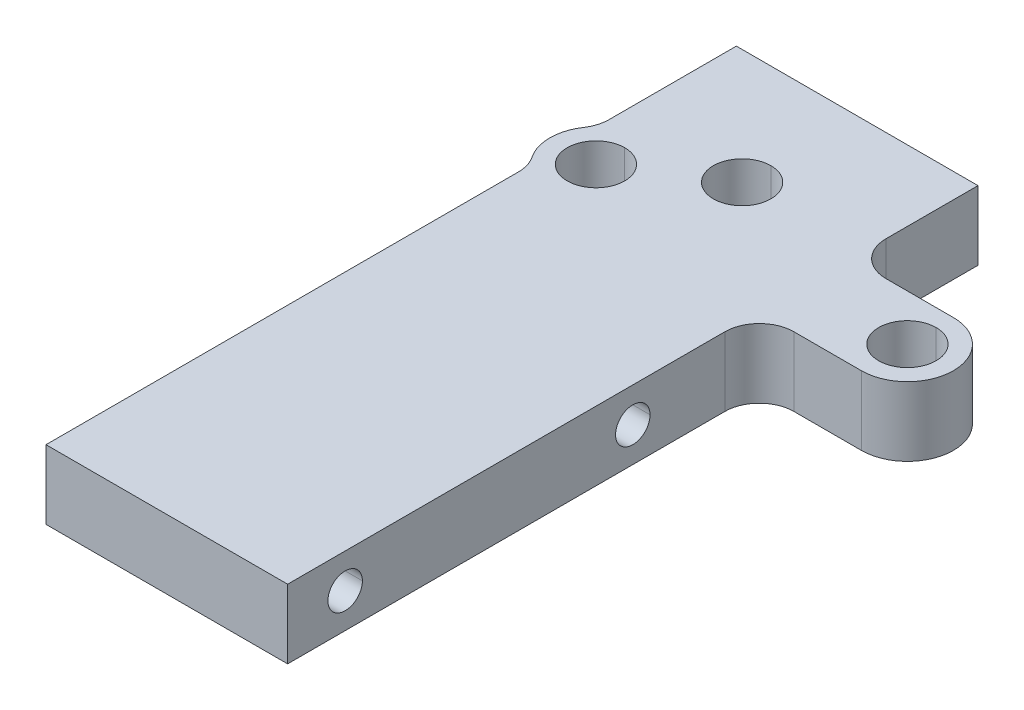
ISO-10303-21;
HEADER;
FILE_DESCRIPTION(('STEP AP214'),'2;1');
FILE_NAME('part.step','',(''),(''),'','','');
FILE_SCHEMA(('AUTOMOTIVE_DESIGN { 1 0 10303 214 1 1 1 1 }'));
ENDSEC;
DATA;
#1=APPLICATION_CONTEXT('core data for automotive mechanical design processes');
#2=APPLICATION_PROTOCOL_DEFINITION('international standard','automotive_design',2000,#1);
#3=PRODUCT_CONTEXT('',#1,'mechanical');
#4=PRODUCT('Part','Part','',(#3));
#5=PRODUCT_RELATED_PRODUCT_CATEGORY('part','',(#4));
#6=PRODUCT_DEFINITION_FORMATION('','',#4);
#7=PRODUCT_DEFINITION_CONTEXT('part definition',#1,'design');
#8=PRODUCT_DEFINITION('design','',#6,#7);
#9=PRODUCT_DEFINITION_SHAPE('','',#8);
#10=(LENGTH_UNIT() NAMED_UNIT(*) SI_UNIT(.MILLI.,.METRE.));
#11=(NAMED_UNIT(*) PLANE_ANGLE_UNIT() SI_UNIT($,.RADIAN.));
#12=(NAMED_UNIT(*) SI_UNIT($,.STERADIAN.) SOLID_ANGLE_UNIT());
#13=UNCERTAINTY_MEASURE_WITH_UNIT(LENGTH_MEASURE(1.E-05),#10,'distance_accuracy_value','');
#14=(GEOMETRIC_REPRESENTATION_CONTEXT(3) GLOBAL_UNCERTAINTY_ASSIGNED_CONTEXT((#13)) GLOBAL_UNIT_ASSIGNED_CONTEXT((#10,
#11,#12)) REPRESENTATION_CONTEXT('',''));
#15=CARTESIAN_POINT('',(0.,0.,0.));
#16=DIRECTION('',(0.,0.,1.));
#17=DIRECTION('',(1.,0.,0.));
#18=AXIS2_PLACEMENT_3D('',#15,#16,#17);
#19=CARTESIAN_POINT('',(29.8649167310371,1.,-45.));
#20=DIRECTION('',(0.,1.,0.));
#21=DIRECTION('',(0.,0.,1.));
#22=AXIS2_PLACEMENT_3D('',#19,#20,#21);
#23=CYLINDRICAL_SURFACE('',#22,2.5);
#24=DIRECTION('',(0.,1.,0.));
#25=VECTOR('',#24,1.);
#26=CARTESIAN_POINT('',(29.8649167310371,1.,-47.5));
#27=LINE('',#26,#25);
#28=CARTESIAN_POINT('',(29.8649167310371,1.,-47.5));
#29=VERTEX_POINT('',#28);
#30=CARTESIAN_POINT('',(29.8649167310371,6.,-47.5));
#31=VERTEX_POINT('',#30);
#32=EDGE_CURVE('E532',#29,#31,#27,.T.);
#33=ORIENTED_EDGE('',*,*,#32,.F.);
#34=CARTESIAN_POINT('',(29.8649167310371,1.,-45.));
#35=DIRECTION('',(0.,1.,0.));
#36=DIRECTION('',(0.,0.,1.));
#37=AXIS2_PLACEMENT_3D('',#34,#35,#36);
#38=CIRCLE('',#37,2.5);
#39=CARTESIAN_POINT('',(29.8649167310371,1.,-42.5));
#40=VERTEX_POINT('',#39);
#41=EDGE_CURVE('E11',#40,#29,#38,.T.);
#42=ORIENTED_EDGE('',*,*,#41,.F.);
#43=DIRECTION('',(0.,1.,0.));
#44=VECTOR('',#43,1.);
#45=CARTESIAN_POINT('',(29.8649167310371,1.,-42.5));
#46=LINE('',#45,#44);
#47=CARTESIAN_POINT('',(29.8649167310371,6.,-42.5));
#48=VERTEX_POINT('',#47);
#49=EDGE_CURVE('E256',#40,#48,#46,.T.);
#50=ORIENTED_EDGE('',*,*,#49,.T.);
#51=CARTESIAN_POINT('',(29.8649167310371,6.,-45.));
#52=DIRECTION('',(0.,1.,0.));
#53=DIRECTION('',(0.,0.,1.));
#54=AXIS2_PLACEMENT_3D('',#51,#52,#53);
#55=CIRCLE('',#54,2.5);
#56=EDGE_CURVE('E286',#48,#31,#55,.T.);
#57=ORIENTED_EDGE('',*,*,#56,.T.);
#58=EDGE_LOOP('',(#33,#42,#50,#57));
#59=FACE_BOUND('',#58,.T.);
#60=ADVANCED_FACE('F17',(#59),#23,.F.);
#61=CARTESIAN_POINT('',(29.8649167310371,1.,-45.));
#62=DIRECTION('',(0.,1.,0.));
#63=DIRECTION('',(1.,0.,0.));
#64=AXIS2_PLACEMENT_3D('',#61,#62,#63);
#65=PLANE('',#64);
#66=CARTESIAN_POINT('',(29.8649167310371,1.,-45.));
#67=DIRECTION('',(0.,-1.,0.));
#68=DIRECTION('',(0.,0.,1.));
#69=AXIS2_PLACEMENT_3D('',#66,#67,#68);
#70=CIRCLE('',#69,1.25);
#71=CARTESIAN_POINT('',(29.8649167310371,1.,-43.75));
#72=VERTEX_POINT('',#71);
#73=CARTESIAN_POINT('',(29.8649167310371,1.,-46.25));
#74=VERTEX_POINT('',#73);
#75=EDGE_CURVE('E263',#72,#74,#70,.T.);
#76=ORIENTED_EDGE('',*,*,#75,.T.);
#77=CARTESIAN_POINT('',(29.8649167310371,1.,-45.));
#78=DIRECTION('',(0.,-1.,0.));
#79=DIRECTION('',(0.,0.,1.));
#80=AXIS2_PLACEMENT_3D('',#77,#78,#79);
#81=CIRCLE('',#80,1.25);
#82=EDGE_CURVE('E381',#74,#72,#81,.T.);
#83=ORIENTED_EDGE('',*,*,#82,.T.);
#84=EDGE_LOOP('',(#76,#83));
#85=FACE_BOUND('',#84,.T.);
#86=ORIENTED_EDGE('',*,*,#41,.T.);
#87=CARTESIAN_POINT('',(29.8649167310371,1.,-45.));
#88=DIRECTION('',(0.,1.,0.));
#89=DIRECTION('',(0.,0.,1.));
#90=AXIS2_PLACEMENT_3D('',#87,#88,#89);
#91=CIRCLE('',#90,2.5);
#92=EDGE_CURVE('E540',#29,#40,#91,.T.);
#93=ORIENTED_EDGE('',*,*,#92,.T.);
#94=EDGE_LOOP('',(#86,#93));
#95=FACE_BOUND('',#94,.T.);
#96=ADVANCED_FACE('F662',(#85,#95),#65,.T.);
#97=CARTESIAN_POINT('',(2.79637384084611,1.,-45.));
#98=DIRECTION('',(0.,1.,0.));
#99=DIRECTION('',(0.,0.,1.));
#100=AXIS2_PLACEMENT_3D('',#97,#98,#99);
#101=CYLINDRICAL_SURFACE('',#100,2.5);
#102=DIRECTION('',(0.,1.,0.));
#103=VECTOR('',#102,1.);
#104=CARTESIAN_POINT('',(2.79637384084612,1.,-47.5));
#105=LINE('',#104,#103);
#106=CARTESIAN_POINT('',(2.79637384084612,1.,-47.5));
#107=VERTEX_POINT('',#106);
#108=CARTESIAN_POINT('',(2.79637384084612,6.,-47.5));
#109=VERTEX_POINT('',#108);
#110=EDGE_CURVE('E276',#107,#109,#105,.T.);
#111=ORIENTED_EDGE('',*,*,#110,.F.);
#112=CARTESIAN_POINT('',(2.79637384084611,1.,-45.));
#113=DIRECTION('',(0.,1.,0.));
#114=DIRECTION('',(0.,0.,1.));
#115=AXIS2_PLACEMENT_3D('',#112,#113,#114);
#116=CIRCLE('',#115,2.5);
#117=CARTESIAN_POINT('',(2.79637384084611,1.,-42.5));
#118=VERTEX_POINT('',#117);
#119=EDGE_CURVE('E25',#118,#107,#116,.T.);
#120=ORIENTED_EDGE('',*,*,#119,.F.);
#121=DIRECTION('',(0.,1.,0.));
#122=VECTOR('',#121,1.);
#123=CARTESIAN_POINT('',(2.79637384084611,1.,-42.5));
#124=LINE('',#123,#122);
#125=CARTESIAN_POINT('',(2.79637384084611,6.,-42.5));
#126=VERTEX_POINT('',#125);
#127=EDGE_CURVE('E285',#118,#126,#124,.T.);
#128=ORIENTED_EDGE('',*,*,#127,.T.);
#129=CARTESIAN_POINT('',(2.79637384084611,6.,-45.));
#130=DIRECTION('',(0.,1.,0.));
#131=DIRECTION('',(0.,0.,1.));
#132=AXIS2_PLACEMENT_3D('',#129,#130,#131);
#133=CIRCLE('',#132,2.5);
#134=EDGE_CURVE('E291',#126,#109,#133,.T.);
#135=ORIENTED_EDGE('',*,*,#134,.T.);
#136=EDGE_LOOP('',(#111,#120,#128,#135));
#137=FACE_BOUND('',#136,.T.);
#138=ADVANCED_FACE('F509',(#137),#101,.F.);
#139=CARTESIAN_POINT('',(2.79637384084611,1.,-45.));
#140=DIRECTION('',(0.,1.,0.));
#141=DIRECTION('',(1.,0.,0.));
#142=AXIS2_PLACEMENT_3D('',#139,#140,#141);
#143=PLANE('',#142);
#144=CARTESIAN_POINT('',(2.79637384084611,1.,-45.));
#145=DIRECTION('',(0.,-1.,0.));
#146=DIRECTION('',(0.,0.,1.));
#147=AXIS2_PLACEMENT_3D('',#144,#145,#146);
#148=CIRCLE('',#147,1.25);
#149=CARTESIAN_POINT('',(2.79637384084611,1.,-43.75));
#150=VERTEX_POINT('',#149);
#151=CARTESIAN_POINT('',(2.79637384084611,1.,-46.25));
#152=VERTEX_POINT('',#151);
#153=EDGE_CURVE('E354',#150,#152,#148,.T.);
#154=ORIENTED_EDGE('',*,*,#153,.T.);
#155=CARTESIAN_POINT('',(2.79637384084611,1.,-45.));
#156=DIRECTION('',(0.,-1.,0.));
#157=DIRECTION('',(0.,0.,1.));
#158=AXIS2_PLACEMENT_3D('',#155,#156,#157);
#159=CIRCLE('',#158,1.25);
#160=EDGE_CURVE('E338',#152,#150,#159,.T.);
#161=ORIENTED_EDGE('',*,*,#160,.T.);
#162=EDGE_LOOP('',(#154,#161));
#163=FACE_BOUND('',#162,.T.);
#164=ORIENTED_EDGE('',*,*,#119,.T.);
#165=CARTESIAN_POINT('',(2.79637384084611,1.,-45.));
#166=DIRECTION('',(0.,1.,0.));
#167=DIRECTION('',(0.,0.,1.));
#168=AXIS2_PLACEMENT_3D('',#165,#166,#167);
#169=CIRCLE('',#168,2.5);
#170=EDGE_CURVE('E281',#107,#118,#169,.T.);
#171=ORIENTED_EDGE('',*,*,#170,.T.);
#172=EDGE_LOOP('',(#164,#171));
#173=FACE_BOUND('',#172,.T.);
#174=ADVANCED_FACE('F501',(#163,#173),#143,.T.);
#175=CARTESIAN_POINT('',(24.,6.,-52.));
#176=DIRECTION('',(0.,-1.,0.));
#177=DIRECTION('',(0.,0.,-1.));
#178=AXIS2_PLACEMENT_3D('',#175,#176,#177);
#179=CYLINDRICAL_SURFACE('',#178,3.);
#180=CARTESIAN_POINT('',(24.,6.,-52.));
#181=DIRECTION('',(0.,-1.,0.));
#182=DIRECTION('',(0.,0.,-1.));
#183=AXIS2_PLACEMENT_3D('',#180,#181,#182);
#184=CIRCLE('',#183,3.);
#185=CARTESIAN_POINT('',(24.,6.,-49.));
#186=VERTEX_POINT('',#185);
#187=CARTESIAN_POINT('',(21.,6.,-52.));
#188=VERTEX_POINT('',#187);
#189=EDGE_CURVE('E429',#186,#188,#184,.T.);
#190=ORIENTED_EDGE('',*,*,#189,.F.);
#191=DIRECTION('',(0.,1.,0.));
#192=VECTOR('',#191,1.);
#193=CARTESIAN_POINT('',(24.,-35.9694690041591,-49.));
#194=LINE('',#193,#192);
#195=CARTESIAN_POINT('',(24.,0.,-49.));
#196=VERTEX_POINT('',#195);
#197=EDGE_CURVE('E471',#196,#186,#194,.T.);
#198=ORIENTED_EDGE('',*,*,#197,.F.);
#199=CARTESIAN_POINT('',(24.,0.,-52.));
#200=DIRECTION('',(0.,1.,0.));
#201=DIRECTION('',(0.,0.,-1.));
#202=AXIS2_PLACEMENT_3D('',#199,#200,#201);
#203=CIRCLE('',#202,3.);
#204=CARTESIAN_POINT('',(21.,0.,-52.));
#205=VERTEX_POINT('',#204);
#206=EDGE_CURVE('E252',#205,#196,#203,.T.);
#207=ORIENTED_EDGE('',*,*,#206,.F.);
#208=DIRECTION('',(0.,-1.,0.));
#209=VECTOR('',#208,1.);
#210=CARTESIAN_POINT('',(21.,6.,-52.));
#211=LINE('',#210,#209);
#212=EDGE_CURVE('E270',#188,#205,#211,.T.);
#213=ORIENTED_EDGE('',*,*,#212,.F.);
#214=EDGE_LOOP('',(#190,#198,#207,#213));
#215=FACE_BOUND('',#214,.T.);
#216=ADVANCED_FACE('F579',(#215),#179,.F.);
#217=CARTESIAN_POINT('',(24.,6.,-38.));
#218=DIRECTION('',(0.,1.,0.));
#219=DIRECTION('',(0.,0.,1.));
#220=AXIS2_PLACEMENT_3D('',#217,#218,#219);
#221=CYLINDRICAL_SURFACE('',#220,3.);
#222=CARTESIAN_POINT('',(24.,0.,-38.));
#223=DIRECTION('',(0.,1.,0.));
#224=DIRECTION('',(0.,0.,-1.));
#225=AXIS2_PLACEMENT_3D('',#222,#223,#224);
#226=CIRCLE('',#225,3.);
#227=CARTESIAN_POINT('',(24.,0.,-41.));
#228=VERTEX_POINT('',#227);
#229=CARTESIAN_POINT('',(21.,0.,-38.));
#230=VERTEX_POINT('',#229);
#231=EDGE_CURVE('E239',#228,#230,#226,.T.);
#232=ORIENTED_EDGE('',*,*,#231,.F.);
#233=DIRECTION('',(0.,-1.,0.));
#234=VECTOR('',#233,1.);
#235=CARTESIAN_POINT('',(24.,-35.9694690041591,-41.));
#236=LINE('',#235,#234);
#237=CARTESIAN_POINT('',(24.,6.,-41.));
#238=VERTEX_POINT('',#237);
#239=EDGE_CURVE('E235',#238,#228,#236,.T.);
#240=ORIENTED_EDGE('',*,*,#239,.F.);
#241=CARTESIAN_POINT('',(24.,6.,-38.));
#242=DIRECTION('',(0.,-1.,0.));
#243=DIRECTION('',(0.,0.,-1.));
#244=AXIS2_PLACEMENT_3D('',#241,#242,#243);
#245=CIRCLE('',#244,3.);
#246=CARTESIAN_POINT('',(21.,6.,-38.));
#247=VERTEX_POINT('',#246);
#248=EDGE_CURVE('E314',#247,#238,#245,.T.);
#249=ORIENTED_EDGE('',*,*,#248,.F.);
#250=DIRECTION('',(0.,1.,0.));
#251=VECTOR('',#250,1.);
#252=CARTESIAN_POINT('',(21.,6.,-38.));
#253=LINE('',#252,#251);
#254=EDGE_CURVE('E52',#230,#247,#253,.T.);
#255=ORIENTED_EDGE('',*,*,#254,.F.);
#256=EDGE_LOOP('',(#232,#240,#249,#255));
#257=FACE_BOUND('',#256,.T.);
#258=ADVANCED_FACE('F583',(#257),#221,.F.);
#259=CARTESIAN_POINT('',(-3.,-35.9694690041591,-41.075455402578));
#260=DIRECTION('',(0.,1.,0.));
#261=DIRECTION('',(0.,0.,1.));
#262=AXIS2_PLACEMENT_3D('',#259,#260,#261);
#263=CYLINDRICAL_SURFACE('',#262,3.);
#264=CARTESIAN_POINT('',(-3.,6.,-41.075455402578));
#265=DIRECTION('',(0.,-1.,0.));
#266=DIRECTION('',(0.,0.,-1.));
#267=AXIS2_PLACEMENT_3D('',#264,#265,#266);
#268=CIRCLE('',#267,3.);
#269=CARTESIAN_POINT('',(-0.515839782494522,6.,-42.7574030871874));
#270=VERTEX_POINT('',#269);
#271=CARTESIAN_POINT('',(0.,6.,-41.075455402578));
#272=VERTEX_POINT('',#271);
#273=EDGE_CURVE('E409',#270,#272,#268,.T.);
#274=ORIENTED_EDGE('',*,*,#273,.F.);
#275=DIRECTION('',(0.,1.,0.));
#276=VECTOR('',#275,1.);
#277=CARTESIAN_POINT('',(-0.515839782494522,-35.9694690041591,-42.7574030871874));
#278=LINE('',#277,#276);
#279=CARTESIAN_POINT('',(-0.515839782494522,0.,-42.7574030871874));
#280=VERTEX_POINT('',#279);
#281=EDGE_CURVE('E490',#280,#270,#278,.T.);
#282=ORIENTED_EDGE('',*,*,#281,.F.);
#283=CARTESIAN_POINT('',(-3.,0.,-41.075455402578));
#284=DIRECTION('',(0.,1.,0.));
#285=DIRECTION('',(0.,0.,-1.));
#286=AXIS2_PLACEMENT_3D('',#283,#284,#285);
#287=CIRCLE('',#286,3.);
#288=CARTESIAN_POINT('',(0.,0.,-41.075455402578));
#289=VERTEX_POINT('',#288);
#290=EDGE_CURVE('E447',#289,#280,#287,.T.);
#291=ORIENTED_EDGE('',*,*,#290,.F.);
#292=DIRECTION('',(0.,-1.,0.));
#293=VECTOR('',#292,1.);
#294=CARTESIAN_POINT('',(0.,6.,-41.075455402578));
#295=LINE('',#294,#293);
#296=EDGE_CURVE('E461',#272,#289,#295,.T.);
#297=ORIENTED_EDGE('',*,*,#296,.F.);
#298=EDGE_LOOP('',(#274,#282,#291,#297));
#299=FACE_BOUND('',#298,.T.);
#300=ADVANCED_FACE('F726',(#299),#263,.F.);
#301=CARTESIAN_POINT('',(-3.,-35.9694690041591,-48.9245445974221));
#302=DIRECTION('',(0.,1.,0.));
#303=DIRECTION('',(0.,0.,1.));
#304=AXIS2_PLACEMENT_3D('',#301,#302,#303);
#305=CYLINDRICAL_SURFACE('',#304,3.);
#306=CARTESIAN_POINT('',(-3.,0.,-48.9245445974221));
#307=DIRECTION('',(0.,1.,0.));
#308=DIRECTION('',(0.,0.,-1.));
#309=AXIS2_PLACEMENT_3D('',#306,#307,#308);
#310=CIRCLE('',#309,3.);
#311=CARTESIAN_POINT('',(-0.515839782494522,0.,-47.2425969128126));
#312=VERTEX_POINT('',#311);
#313=CARTESIAN_POINT('',(0.,0.,-48.9245445974221));
#314=VERTEX_POINT('',#313);
#315=EDGE_CURVE('E350',#312,#314,#310,.T.);
#316=ORIENTED_EDGE('',*,*,#315,.F.);
#317=DIRECTION('',(0.,-1.,0.));
#318=VECTOR('',#317,1.);
#319=CARTESIAN_POINT('',(-0.515839782494522,-35.9694690041591,-47.2425969128126));
#320=LINE('',#319,#318);
#321=CARTESIAN_POINT('',(-0.515839782494522,6.,-47.2425969128126));
#322=VERTEX_POINT('',#321);
#323=EDGE_CURVE('E470',#322,#312,#320,.T.);
#324=ORIENTED_EDGE('',*,*,#323,.F.);
#325=CARTESIAN_POINT('',(-3.,6.,-48.9245445974221));
#326=DIRECTION('',(0.,-1.,0.));
#327=DIRECTION('',(0.,0.,-1.));
#328=AXIS2_PLACEMENT_3D('',#325,#326,#327);
#329=CIRCLE('',#328,3.);
#330=CARTESIAN_POINT('',(0.,6.,-48.9245445974221));
#331=VERTEX_POINT('',#330);
#332=EDGE_CURVE('E408',#331,#322,#329,.T.);
#333=ORIENTED_EDGE('',*,*,#332,.F.);
#334=DIRECTION('',(0.,1.,0.));
#335=VECTOR('',#334,1.);
#336=CARTESIAN_POINT('',(0.,6.,-48.9245445974221));
#337=LINE('',#336,#335);
#338=EDGE_CURVE('E297',#314,#331,#337,.T.);
#339=ORIENTED_EDGE('',*,*,#338,.F.);
#340=EDGE_LOOP('',(#316,#324,#333,#339));
#341=FACE_BOUND('',#340,.T.);
#342=ADVANCED_FACE('F567',(#341),#305,.F.);
#343=CARTESIAN_POINT('',(2.79637384084611,-35.9694690041591,-45.));
#344=DIRECTION('',(0.,1.,0.));
#345=DIRECTION('',(0.,0.,1.));
#346=AXIS2_PLACEMENT_3D('',#343,#344,#345);
#347=CYLINDRICAL_SURFACE('',#346,4.);
#348=CARTESIAN_POINT('',(2.79637384084611,6.,-45.));
#349=DIRECTION('',(0.,1.,0.));
#350=DIRECTION('',(0.,0.,1.));
#351=AXIS2_PLACEMENT_3D('',#348,#349,#350);
#352=CIRCLE('',#351,4.);
#353=EDGE_CURVE('E413',#322,#270,#352,.T.);
#354=ORIENTED_EDGE('',*,*,#353,.F.);
#355=ORIENTED_EDGE('',*,*,#323,.T.);
#356=CARTESIAN_POINT('',(2.79637384084611,0.,-45.));
#357=DIRECTION('',(0.,1.,0.));
#358=DIRECTION('',(0.,0.,-1.));
#359=AXIS2_PLACEMENT_3D('',#356,#357,#358);
#360=CIRCLE('',#359,4.);
#361=EDGE_CURVE('E448',#312,#280,#360,.T.);
#362=ORIENTED_EDGE('',*,*,#361,.T.);
#363=ORIENTED_EDGE('',*,*,#281,.T.);
#364=EDGE_LOOP('',(#354,#355,#362,#363));
#365=FACE_BOUND('',#364,.T.);
#366=ADVANCED_FACE('F748',(#365),#347,.T.);
#367=CARTESIAN_POINT('',(2.79637384084611,-35.9694690041591,-41.));
#368=DIRECTION('',(0.,0.,1.));
#369=DIRECTION('',(1.,0.,0.));
#370=AXIS2_PLACEMENT_3D('',#367,#368,#369);
#371=PLANE('',#370);
#372=DIRECTION('',(1.,0.,0.));
#373=VECTOR('',#372,1.);
#374=CARTESIAN_POINT('',(2.79637384084611,6.,-41.));
#375=LINE('',#374,#373);
#376=CARTESIAN_POINT('',(29.8649167310371,6.,-41.));
#377=VERTEX_POINT('',#376);
#378=EDGE_CURVE('E387',#238,#377,#375,.T.);
#379=ORIENTED_EDGE('',*,*,#378,.F.);
#380=ORIENTED_EDGE('',*,*,#239,.T.);
#381=DIRECTION('',(1.,0.,0.));
#382=VECTOR('',#381,1.);
#383=CARTESIAN_POINT('',(2.79637384084611,0.,-41.));
#384=LINE('',#383,#382);
#385=CARTESIAN_POINT('',(29.8649167310371,0.,-41.));
#386=VERTEX_POINT('',#385);
#387=EDGE_CURVE('E233',#228,#386,#384,.T.);
#388=ORIENTED_EDGE('',*,*,#387,.T.);
#389=DIRECTION('',(0.,1.,0.));
#390=VECTOR('',#389,1.);
#391=CARTESIAN_POINT('',(29.8649167310371,-35.9694690041591,-41.));
#392=LINE('',#391,#390);
#393=EDGE_CURVE('E217',#386,#377,#392,.T.);
#394=ORIENTED_EDGE('',*,*,#393,.T.);
#395=EDGE_LOOP('',(#379,#380,#388,#394));
#396=FACE_BOUND('',#395,.T.);
#397=ADVANCED_FACE('F234',(#396),#371,.T.);
#398=CARTESIAN_POINT('',(2.79637384084611,-35.9694690041591,-49.));
#399=DIRECTION('',(0.,0.,-1.));
#400=DIRECTION('',(0.,-1.,0.));
#401=AXIS2_PLACEMENT_3D('',#398,#399,#400);
#402=PLANE('',#401);
#403=DIRECTION('',(-1.,0.,0.));
#404=VECTOR('',#403,1.);
#405=CARTESIAN_POINT('',(2.79637384084611,0.,-49.));
#406=LINE('',#405,#404);
#407=CARTESIAN_POINT('',(29.8649167310371,0.,-49.));
#408=VERTEX_POINT('',#407);
#409=EDGE_CURVE('E245',#408,#196,#406,.T.);
#410=ORIENTED_EDGE('',*,*,#409,.T.);
#411=ORIENTED_EDGE('',*,*,#197,.T.);
#412=DIRECTION('',(-1.,0.,0.));
#413=VECTOR('',#412,1.);
#414=CARTESIAN_POINT('',(2.79637384084611,6.,-49.));
#415=LINE('',#414,#413);
#416=CARTESIAN_POINT('',(29.8649167310371,6.,-49.));
#417=VERTEX_POINT('',#416);
#418=EDGE_CURVE('E432',#417,#186,#415,.T.);
#419=ORIENTED_EDGE('',*,*,#418,.F.);
#420=DIRECTION('',(0.,1.,0.));
#421=VECTOR('',#420,1.);
#422=CARTESIAN_POINT('',(29.8649167310371,-35.9694690041591,-49.));
#423=LINE('',#422,#421);
#424=EDGE_CURVE('E229',#408,#417,#423,.T.);
#425=ORIENTED_EDGE('',*,*,#424,.F.);
#426=EDGE_LOOP('',(#410,#411,#419,#425));
#427=FACE_BOUND('',#426,.T.);
#428=ADVANCED_FACE('F582',(#427),#402,.T.);
#429=CARTESIAN_POINT('',(29.8649167310371,-35.9694690041591,-45.));
#430=DIRECTION('',(0.,1.,0.));
#431=DIRECTION('',(0.,0.,1.));
#432=AXIS2_PLACEMENT_3D('',#429,#430,#431);
#433=CYLINDRICAL_SURFACE('',#432,4.);
#434=ORIENTED_EDGE('',*,*,#393,.F.);
#435=CARTESIAN_POINT('',(29.8649167310371,0.,-45.));
#436=DIRECTION('',(0.,1.,0.));
#437=DIRECTION('',(0.,0.,-1.));
#438=AXIS2_PLACEMENT_3D('',#435,#436,#437);
#439=CIRCLE('',#438,4.);
#440=EDGE_CURVE('E221',#386,#408,#439,.T.);
#441=ORIENTED_EDGE('',*,*,#440,.T.);
#442=ORIENTED_EDGE('',*,*,#424,.T.);
#443=CARTESIAN_POINT('',(29.8649167310371,6.,-45.));
#444=DIRECTION('',(0.,1.,0.));
#445=DIRECTION('',(0.,0.,1.));
#446=AXIS2_PLACEMENT_3D('',#443,#444,#445);
#447=CIRCLE('',#446,4.);
#448=EDGE_CURVE('E224',#377,#417,#447,.T.);
#449=ORIENTED_EDGE('',*,*,#448,.F.);
#450=EDGE_LOOP('',(#434,#441,#442,#449));
#451=FACE_BOUND('',#450,.T.);
#452=ADVANCED_FACE('F219',(#451),#433,.T.);
#453=CARTESIAN_POINT('',(-0.001000000000001,3.,-30.));
#454=DIRECTION('',(1.,0.,0.));
#455=DIRECTION('',(0.,0.,-1.));
#456=AXIS2_PLACEMENT_3D('',#453,#454,#455);
#457=CYLINDRICAL_SURFACE('',#456,1.5);
#458=DIRECTION('',(1.,0.,0.));
#459=VECTOR('',#458,1.);
#460=CARTESIAN_POINT('',(-0.001000000000001,3.,-28.5));
#461=LINE('',#460,#459);
#462=CARTESIAN_POINT('',(0.,3.,-28.5));
#463=VERTEX_POINT('',#462);
#464=CARTESIAN_POINT('',(21.,3.,-28.5));
#465=VERTEX_POINT('',#464);
#466=EDGE_CURVE('E319',#463,#465,#461,.T.);
#467=ORIENTED_EDGE('',*,*,#466,.F.);
#468=CARTESIAN_POINT('',(0.,3.,-30.));
#469=DIRECTION('',(-1.,0.,0.));
#470=DIRECTION('',(0.,0.,-1.));
#471=AXIS2_PLACEMENT_3D('',#468,#469,#470);
#472=CIRCLE('',#471,1.5);
#473=CARTESIAN_POINT('',(0.,3.,-31.5));
#474=VERTEX_POINT('',#473);
#475=EDGE_CURVE('E467',#463,#474,#472,.T.);
#476=ORIENTED_EDGE('',*,*,#475,.T.);
#477=DIRECTION('',(1.,0.,0.));
#478=VECTOR('',#477,1.);
#479=CARTESIAN_POINT('',(-0.001000000000001,3.,-31.5));
#480=LINE('',#479,#478);
#481=CARTESIAN_POINT('',(21.,3.,-31.5));
#482=VERTEX_POINT('',#481);
#483=EDGE_CURVE('E305',#474,#482,#480,.T.);
#484=ORIENTED_EDGE('',*,*,#483,.T.);
#485=CARTESIAN_POINT('',(21.,3.,-30.));
#486=DIRECTION('',(1.,0.,0.));
#487=DIRECTION('',(0.,0.,-1.));
#488=AXIS2_PLACEMENT_3D('',#485,#486,#487);
#489=CIRCLE('',#488,1.5);
#490=EDGE_CURVE('E382',#482,#465,#489,.T.);
#491=ORIENTED_EDGE('',*,*,#490,.T.);
#492=EDGE_LOOP('',(#467,#476,#484,#491));
#493=FACE_BOUND('',#492,.T.);
#494=ADVANCED_FACE('F606',(#493),#457,.F.);
#495=CARTESIAN_POINT('',(-0.001000000000001,3.,-5.00000000000011));
#496=DIRECTION('',(1.,0.,0.));
#497=DIRECTION('',(0.,0.,-1.));
#498=AXIS2_PLACEMENT_3D('',#495,#496,#497);
#499=CYLINDRICAL_SURFACE('',#498,1.5);
#500=DIRECTION('',(1.,0.,0.));
#501=VECTOR('',#500,1.);
#502=CARTESIAN_POINT('',(-0.001000000000001,3.,-3.50000000000011));
#503=LINE('',#502,#501);
#504=CARTESIAN_POINT('',(0.,3.,-3.50000000000011));
#505=VERTEX_POINT('',#504);
#506=CARTESIAN_POINT('',(21.,3.,-3.50000000000011));
#507=VERTEX_POINT('',#506);
#508=EDGE_CURVE('E264',#505,#507,#503,.T.);
#509=ORIENTED_EDGE('',*,*,#508,.F.);
#510=CARTESIAN_POINT('',(0.,3.,-5.00000000000011));
#511=DIRECTION('',(-1.,0.,0.));
#512=DIRECTION('',(0.,0.,-1.));
#513=AXIS2_PLACEMENT_3D('',#510,#511,#512);
#514=CIRCLE('',#513,1.5);
#515=CARTESIAN_POINT('',(0.,3.,-6.50000000000011));
#516=VERTEX_POINT('',#515);
#517=EDGE_CURVE('E475',#505,#516,#514,.T.);
#518=ORIENTED_EDGE('',*,*,#517,.T.);
#519=DIRECTION('',(1.,0.,0.));
#520=VECTOR('',#519,1.);
#521=CARTESIAN_POINT('',(-0.001000000000001,3.,-6.50000000000011));
#522=LINE('',#521,#520);
#523=CARTESIAN_POINT('',(21.,3.,-6.50000000000011));
#524=VERTEX_POINT('',#523);
#525=EDGE_CURVE('E320',#516,#524,#522,.T.);
#526=ORIENTED_EDGE('',*,*,#525,.T.);
#527=CARTESIAN_POINT('',(21.,3.,-5.00000000000011));
#528=DIRECTION('',(1.,0.,0.));
#529=DIRECTION('',(0.,0.,-1.));
#530=AXIS2_PLACEMENT_3D('',#527,#528,#529);
#531=CIRCLE('',#530,1.5);
#532=EDGE_CURVE('E230',#524,#507,#531,.T.);
#533=ORIENTED_EDGE('',*,*,#532,.T.);
#534=EDGE_LOOP('',(#509,#518,#526,#533));
#535=FACE_BOUND('',#534,.T.);
#536=ADVANCED_FACE('F781',(#535),#499,.F.);
#537=CARTESIAN_POINT('',(10.5,6.,-50.));
#538=DIRECTION('',(0.,-1.,0.));
#539=DIRECTION('',(0.,0.,-1.));
#540=AXIS2_PLACEMENT_3D('',#537,#538,#539);
#541=CYLINDRICAL_SURFACE('',#540,2.5);
#542=DIRECTION('',(0.,-1.,0.));
#543=VECTOR('',#542,1.);
#544=CARTESIAN_POINT('',(10.5,6.,-47.5));
#545=LINE('',#544,#543);
#546=CARTESIAN_POINT('',(10.5,6.,-47.5));
#547=VERTEX_POINT('',#546);
#548=CARTESIAN_POINT('',(10.5,0.,-47.5));
#549=VERTEX_POINT('',#548);
#550=EDGE_CURVE('E328',#547,#549,#545,.T.);
#551=ORIENTED_EDGE('',*,*,#550,.F.);
#552=CARTESIAN_POINT('',(10.5,6.,-50.));
#553=DIRECTION('',(0.,1.,0.));
#554=DIRECTION('',(0.,0.,1.));
#555=AXIS2_PLACEMENT_3D('',#552,#553,#554);
#556=CIRCLE('',#555,2.5);
#557=CARTESIAN_POINT('',(10.5,6.,-52.5));
#558=VERTEX_POINT('',#557);
#559=EDGE_CURVE('E290',#547,#558,#556,.T.);
#560=ORIENTED_EDGE('',*,*,#559,.T.);
#561=DIRECTION('',(0.,-1.,0.));
#562=VECTOR('',#561,1.);
#563=CARTESIAN_POINT('',(10.5,6.,-52.5));
#564=LINE('',#563,#562);
#565=CARTESIAN_POINT('',(10.5,0.,-52.5));
#566=VERTEX_POINT('',#565);
#567=EDGE_CURVE('E333',#558,#566,#564,.T.);
#568=ORIENTED_EDGE('',*,*,#567,.T.);
#569=CARTESIAN_POINT('',(10.5,0.,-50.));
#570=DIRECTION('',(0.,1.,0.));
#571=DIRECTION('',(0.,0.,1.));
#572=AXIS2_PLACEMENT_3D('',#569,#570,#571);
#573=CIRCLE('',#572,2.5);
#574=EDGE_CURVE('E458',#549,#566,#573,.T.);
#575=ORIENTED_EDGE('',*,*,#574,.F.);
#576=EDGE_LOOP('',(#551,#560,#568,#575));
#577=FACE_BOUND('',#576,.T.);
#578=ADVANCED_FACE('F792',(#577),#541,.F.);
#579=CARTESIAN_POINT('',(0.,6.,-60.));
#580=DIRECTION('',(0.,0.,1.));
#581=DIRECTION('',(1.,0.,0.));
#582=AXIS2_PLACEMENT_3D('',#579,#580,#581);
#583=PLANE('',#582);
#584=DIRECTION('',(-1.,0.,0.));
#585=VECTOR('',#584,1.);
#586=CARTESIAN_POINT('',(0.,0.,-60.));
#587=LINE('',#586,#585);
#588=CARTESIAN_POINT('',(21.,0.,-60.));
#589=VERTEX_POINT('',#588);
#590=CARTESIAN_POINT('',(0.,0.,-60.));
#591=VERTEX_POINT('',#590);
#592=EDGE_CURVE('E347',#589,#591,#587,.T.);
#593=ORIENTED_EDGE('',*,*,#592,.T.);
#594=DIRECTION('',(0.,-1.,0.));
#595=VECTOR('',#594,1.);
#596=CARTESIAN_POINT('',(0.,6.,-60.));
#597=LINE('',#596,#595);
#598=CARTESIAN_POINT('',(0.,6.,-60.));
#599=VERTEX_POINT('',#598);
#600=EDGE_CURVE('E296',#599,#591,#597,.T.);
#601=ORIENTED_EDGE('',*,*,#600,.F.);
#602=DIRECTION('',(-1.,0.,0.));
#603=VECTOR('',#602,1.);
#604=CARTESIAN_POINT('',(0.,6.,-60.));
#605=LINE('',#604,#603);
#606=CARTESIAN_POINT('',(21.,6.,-60.));
#607=VERTEX_POINT('',#606);
#608=EDGE_CURVE('E426',#607,#599,#605,.T.);
#609=ORIENTED_EDGE('',*,*,#608,.F.);
#610=DIRECTION('',(0.,-1.,0.));
#611=VECTOR('',#610,1.);
#612=CARTESIAN_POINT('',(21.,6.,-60.));
#613=LINE('',#612,#611);
#614=EDGE_CURVE('E404',#607,#589,#613,.T.);
#615=ORIENTED_EDGE('',*,*,#614,.T.);
#616=EDGE_LOOP('',(#593,#601,#609,#615));
#617=FACE_BOUND('',#616,.T.);
#618=ADVANCED_FACE('F573',(#617),#583,.F.);
#619=CARTESIAN_POINT('',(21.,6.,0.));
#620=DIRECTION('',(-1.,0.,0.));
#621=DIRECTION('',(0.,0.,1.));
#622=AXIS2_PLACEMENT_3D('',#619,#620,#621);
#623=PLANE('',#622);
#624=ORIENTED_EDGE('',*,*,#532,.F.);
#625=CARTESIAN_POINT('',(21.,3.,-5.00000000000011));
#626=DIRECTION('',(1.,0.,0.));
#627=DIRECTION('',(0.,0.,-1.));
#628=AXIS2_PLACEMENT_3D('',#625,#626,#627);
#629=CIRCLE('',#628,1.5);
#630=EDGE_CURVE('E268',#507,#524,#629,.T.);
#631=ORIENTED_EDGE('',*,*,#630,.F.);
#632=EDGE_LOOP('',(#624,#631));
#633=FACE_BOUND('',#632,.T.);
#634=ORIENTED_EDGE('',*,*,#490,.F.);
#635=CARTESIAN_POINT('',(21.,3.,-30.));
#636=DIRECTION('',(1.,0.,0.));
#637=DIRECTION('',(0.,0.,-1.));
#638=AXIS2_PLACEMENT_3D('',#635,#636,#637);
#639=CIRCLE('',#638,1.5);
#640=EDGE_CURVE('E309',#465,#482,#639,.T.);
#641=ORIENTED_EDGE('',*,*,#640,.F.);
#642=EDGE_LOOP('',(#634,#641));
#643=FACE_BOUND('',#642,.T.);
#644=DIRECTION('',(0.,0.,-1.));
#645=VECTOR('',#644,1.);
#646=CARTESIAN_POINT('',(21.,0.,0.));
#647=LINE('',#646,#645);
#648=CARTESIAN_POINT('',(21.,0.,0.));
#649=VERTEX_POINT('',#648);
#650=EDGE_CURVE('E454',#649,#230,#647,.T.);
#651=ORIENTED_EDGE('',*,*,#650,.T.);
#652=ORIENTED_EDGE('',*,*,#254,.T.);
#653=DIRECTION('',(0.,0.,-1.));
#654=VECTOR('',#653,1.);
#655=CARTESIAN_POINT('',(21.,6.,0.));
#656=LINE('',#655,#654);
#657=CARTESIAN_POINT('',(21.,6.,0.));
#658=VERTEX_POINT('',#657);
#659=EDGE_CURVE('E310',#658,#247,#656,.T.);
#660=ORIENTED_EDGE('',*,*,#659,.F.);
#661=DIRECTION('',(0.,-1.,0.));
#662=VECTOR('',#661,1.);
#663=CARTESIAN_POINT('',(21.,6.,0.));
#664=LINE('',#663,#662);
#665=EDGE_CURVE('E38',#658,#649,#664,.T.);
#666=ORIENTED_EDGE('',*,*,#665,.T.);
#667=EDGE_LOOP('',(#651,#652,#660,#666));
#668=FACE_BOUND('',#667,.T.);
#669=ADVANCED_FACE('F814',(#633,#643,#668),#623,.F.);
#670=CARTESIAN_POINT('',(0.,6.,0.));
#671=DIRECTION('',(0.,0.,-1.));
#672=DIRECTION('',(0.,-1.,0.));
#673=AXIS2_PLACEMENT_3D('',#670,#671,#672);
#674=PLANE('',#673);
#675=DIRECTION('',(1.,0.,0.));
#676=VECTOR('',#675,1.);
#677=CARTESIAN_POINT('',(0.,0.,0.));
#678=LINE('',#677,#676);
#679=CARTESIAN_POINT('',(0.,0.,0.));
#680=VERTEX_POINT('',#679);
#681=EDGE_CURVE('E457',#680,#649,#678,.T.);
#682=ORIENTED_EDGE('',*,*,#681,.T.);
#683=ORIENTED_EDGE('',*,*,#665,.F.);
#684=DIRECTION('',(1.,0.,0.));
#685=VECTOR('',#684,1.);
#686=CARTESIAN_POINT('',(0.,6.,0.));
#687=LINE('',#686,#685);
#688=CARTESIAN_POINT('',(0.,6.,0.));
#689=VERTEX_POINT('',#688);
#690=EDGE_CURVE('E315',#689,#658,#687,.T.);
#691=ORIENTED_EDGE('',*,*,#690,.F.);
#692=DIRECTION('',(0.,-1.,0.));
#693=VECTOR('',#692,1.);
#694=CARTESIAN_POINT('',(0.,6.,0.));
#695=LINE('',#694,#693);
#696=EDGE_CURVE('E464',#689,#680,#695,.T.);
#697=ORIENTED_EDGE('',*,*,#696,.T.);
#698=EDGE_LOOP('',(#682,#683,#691,#697));
#699=FACE_BOUND('',#698,.T.);
#700=ADVANCED_FACE('F836',(#699),#674,.F.);
#701=CARTESIAN_POINT('',(0.,6.,0.));
#702=DIRECTION('',(1.,0.,0.));
#703=DIRECTION('',(0.,1.,0.));
#704=AXIS2_PLACEMENT_3D('',#701,#702,#703);
#705=PLANE('',#704);
#706=CARTESIAN_POINT('',(0.,3.,-5.00000000000011));
#707=DIRECTION('',(-1.,0.,0.));
#708=DIRECTION('',(0.,0.,-1.));
#709=AXIS2_PLACEMENT_3D('',#706,#707,#708);
#710=CIRCLE('',#709,1.5);
#711=EDGE_CURVE('E269',#516,#505,#710,.T.);
#712=ORIENTED_EDGE('',*,*,#711,.F.);
#713=ORIENTED_EDGE('',*,*,#517,.F.);
#714=EDGE_LOOP('',(#712,#713));
#715=FACE_BOUND('',#714,.T.);
#716=CARTESIAN_POINT('',(0.,3.,-30.));
#717=DIRECTION('',(-1.,0.,0.));
#718=DIRECTION('',(0.,0.,-1.));
#719=AXIS2_PLACEMENT_3D('',#716,#717,#718);
#720=CIRCLE('',#719,1.5);
#721=EDGE_CURVE('E301',#474,#463,#720,.T.);
#722=ORIENTED_EDGE('',*,*,#721,.F.);
#723=ORIENTED_EDGE('',*,*,#475,.F.);
#724=EDGE_LOOP('',(#722,#723));
#725=FACE_BOUND('',#724,.T.);
#726=DIRECTION('',(0.,0.,1.));
#727=VECTOR('',#726,1.);
#728=CARTESIAN_POINT('',(0.,6.,0.));
#729=LINE('',#728,#727);
#730=EDGE_CURVE('E372',#272,#689,#729,.T.);
#731=ORIENTED_EDGE('',*,*,#730,.F.);
#732=ORIENTED_EDGE('',*,*,#296,.T.);
#733=DIRECTION('',(0.,0.,1.));
#734=VECTOR('',#733,1.);
#735=CARTESIAN_POINT('',(0.,0.,0.));
#736=LINE('',#735,#734);
#737=EDGE_CURVE('E443',#289,#680,#736,.T.);
#738=ORIENTED_EDGE('',*,*,#737,.T.);
#739=ORIENTED_EDGE('',*,*,#696,.F.);
#740=EDGE_LOOP('',(#731,#732,#738,#739));
#741=FACE_BOUND('',#740,.T.);
#742=ADVANCED_FACE('F831',(#715,#725,#741),#705,.F.);
#743=CARTESIAN_POINT('',(0.,0.,0.));
#744=DIRECTION('',(0.,-1.,0.));
#745=DIRECTION('',(0.,0.,-1.));
#746=AXIS2_PLACEMENT_3D('',#743,#744,#745);
#747=PLANE('',#746);
#748=CARTESIAN_POINT('',(29.8649167310371,0.,-45.));
#749=DIRECTION('',(0.,1.,0.));
#750=DIRECTION('',(0.,0.,-1.));
#751=AXIS2_PLACEMENT_3D('',#748,#749,#750);
#752=CIRCLE('',#751,1.25);
#753=CARTESIAN_POINT('',(29.8649167310371,0.,-43.75));
#754=VERTEX_POINT('',#753);
#755=CARTESIAN_POINT('',(29.8649167310371,0.,-46.25));
#756=VERTEX_POINT('',#755);
#757=EDGE_CURVE('E262',#754,#756,#752,.T.);
#758=ORIENTED_EDGE('',*,*,#757,.T.);
#759=CARTESIAN_POINT('',(29.8649167310371,0.,-45.));
#760=DIRECTION('',(0.,1.,0.));
#761=DIRECTION('',(0.,0.,-1.));
#762=AXIS2_PLACEMENT_3D('',#759,#760,#761);
#763=CIRCLE('',#762,1.25);
#764=EDGE_CURVE('E362',#756,#754,#763,.T.);
#765=ORIENTED_EDGE('',*,*,#764,.T.);
#766=EDGE_LOOP('',(#758,#765));
#767=FACE_BOUND('',#766,.T.);
#768=CARTESIAN_POINT('',(10.5,0.,-50.));
#769=DIRECTION('',(0.,1.,0.));
#770=DIRECTION('',(0.,0.,1.));
#771=AXIS2_PLACEMENT_3D('',#768,#769,#770);
#772=CIRCLE('',#771,2.5);
#773=EDGE_CURVE('E329',#566,#549,#772,.T.);
#774=ORIENTED_EDGE('',*,*,#773,.T.);
#775=ORIENTED_EDGE('',*,*,#574,.T.);
#776=EDGE_LOOP('',(#774,#775));
#777=FACE_BOUND('',#776,.T.);
#778=CARTESIAN_POINT('',(2.79637384084611,0.,-45.));
#779=DIRECTION('',(0.,1.,0.));
#780=DIRECTION('',(0.,0.,-1.));
#781=AXIS2_PLACEMENT_3D('',#778,#779,#780);
#782=CIRCLE('',#781,1.25);
#783=CARTESIAN_POINT('',(2.79637384084611,0.,-43.75));
#784=VERTEX_POINT('',#783);
#785=CARTESIAN_POINT('',(2.79637384084611,0.,-46.25));
#786=VERTEX_POINT('',#785);
#787=EDGE_CURVE('E342',#784,#786,#782,.T.);
#788=ORIENTED_EDGE('',*,*,#787,.T.);
#789=CARTESIAN_POINT('',(2.79637384084611,0.,-45.));
#790=DIRECTION('',(0.,1.,0.));
#791=DIRECTION('',(0.,0.,-1.));
#792=AXIS2_PLACEMENT_3D('',#789,#790,#791);
#793=CIRCLE('',#792,1.25);
#794=EDGE_CURVE('E337',#786,#784,#793,.T.);
#795=ORIENTED_EDGE('',*,*,#794,.T.);
#796=EDGE_LOOP('',(#788,#795));
#797=FACE_BOUND('',#796,.T.);
#798=ORIENTED_EDGE('',*,*,#737,.F.);
#799=ORIENTED_EDGE('',*,*,#290,.T.);
#800=ORIENTED_EDGE('',*,*,#361,.F.);
#801=ORIENTED_EDGE('',*,*,#315,.T.);
#802=DIRECTION('',(0.,0.,1.));
#803=VECTOR('',#802,1.);
#804=CARTESIAN_POINT('',(0.,0.,0.));
#805=LINE('',#804,#803);
#806=EDGE_CURVE('E341',#591,#314,#805,.T.);
#807=ORIENTED_EDGE('',*,*,#806,.F.);
#808=ORIENTED_EDGE('',*,*,#592,.F.);
#809=DIRECTION('',(0.,0.,-1.));
#810=VECTOR('',#809,1.);
#811=CARTESIAN_POINT('',(21.,0.,0.));
#812=LINE('',#811,#810);
#813=EDGE_CURVE('E274',#205,#589,#812,.T.);
#814=ORIENTED_EDGE('',*,*,#813,.F.);
#815=ORIENTED_EDGE('',*,*,#206,.T.);
#816=ORIENTED_EDGE('',*,*,#409,.F.);
#817=ORIENTED_EDGE('',*,*,#440,.F.);
#818=ORIENTED_EDGE('',*,*,#387,.F.);
#819=ORIENTED_EDGE('',*,*,#231,.T.);
#820=ORIENTED_EDGE('',*,*,#650,.F.);
#821=ORIENTED_EDGE('',*,*,#681,.F.);
#822=EDGE_LOOP('',(#798,#799,#800,#801,#807,#808,#814,#815,#816,#817,#818,#819,#820,#821));
#823=FACE_BOUND('',#822,.T.);
#824=ADVANCED_FACE('F242',(#767,#777,#797,#823),#747,.T.);
#825=CARTESIAN_POINT('',(0.,6.,0.));
#826=DIRECTION('',(0.,-1.,0.));
#827=DIRECTION('',(0.,0.,-1.));
#828=AXIS2_PLACEMENT_3D('',#825,#826,#827);
#829=PLANE('',#828);
#830=CARTESIAN_POINT('',(10.5,6.,-50.));
#831=DIRECTION('',(0.,1.,0.));
#832=DIRECTION('',(0.,0.,1.));
#833=AXIS2_PLACEMENT_3D('',#830,#831,#832);
#834=CIRCLE('',#833,2.5);
#835=EDGE_CURVE('E324',#558,#547,#834,.T.);
#836=ORIENTED_EDGE('',*,*,#835,.F.);
#837=ORIENTED_EDGE('',*,*,#559,.F.);
#838=EDGE_LOOP('',(#836,#837));
#839=FACE_BOUND('',#838,.T.);
#840=ORIENTED_EDGE('',*,*,#56,.F.);
#841=CARTESIAN_POINT('',(29.8649167310371,6.,-45.));
#842=DIRECTION('',(0.,1.,0.));
#843=DIRECTION('',(0.,0.,1.));
#844=AXIS2_PLACEMENT_3D('',#841,#842,#843);
#845=CIRCLE('',#844,2.5);
#846=EDGE_CURVE('E521',#31,#48,#845,.T.);
#847=ORIENTED_EDGE('',*,*,#846,.F.);
#848=EDGE_LOOP('',(#840,#847));
#849=FACE_BOUND('',#848,.T.);
#850=ORIENTED_EDGE('',*,*,#134,.F.);
#851=CARTESIAN_POINT('',(2.79637384084611,6.,-45.));
#852=DIRECTION('',(0.,1.,0.));
#853=DIRECTION('',(0.,0.,1.));
#854=AXIS2_PLACEMENT_3D('',#851,#852,#853);
#855=CIRCLE('',#854,2.5);
#856=EDGE_CURVE('E280',#109,#126,#855,.T.);
#857=ORIENTED_EDGE('',*,*,#856,.F.);
#858=EDGE_LOOP('',(#850,#857));
#859=FACE_BOUND('',#858,.T.);
#860=DIRECTION('',(0.,0.,1.));
#861=VECTOR('',#860,1.);
#862=CARTESIAN_POINT('',(0.,6.,0.));
#863=LINE('',#862,#861);
#864=EDGE_CURVE('E292',#599,#331,#863,.T.);
#865=ORIENTED_EDGE('',*,*,#864,.T.);
#866=ORIENTED_EDGE('',*,*,#332,.T.);
#867=ORIENTED_EDGE('',*,*,#353,.T.);
#868=ORIENTED_EDGE('',*,*,#273,.T.);
#869=ORIENTED_EDGE('',*,*,#730,.T.);
#870=ORIENTED_EDGE('',*,*,#690,.T.);
#871=ORIENTED_EDGE('',*,*,#659,.T.);
#872=ORIENTED_EDGE('',*,*,#248,.T.);
#873=ORIENTED_EDGE('',*,*,#378,.T.);
#874=ORIENTED_EDGE('',*,*,#448,.T.);
#875=ORIENTED_EDGE('',*,*,#418,.T.);
#876=ORIENTED_EDGE('',*,*,#189,.T.);
#877=DIRECTION('',(0.,0.,-1.));
#878=VECTOR('',#877,1.);
#879=CARTESIAN_POINT('',(21.,6.,0.));
#880=LINE('',#879,#878);
#881=EDGE_CURVE('E275',#188,#607,#880,.T.);
#882=ORIENTED_EDGE('',*,*,#881,.T.);
#883=ORIENTED_EDGE('',*,*,#608,.T.);
#884=EDGE_LOOP('',(#865,#866,#867,#868,#869,#870,#871,#872,#873,#874,#875,#876,#882,#883));
#885=FACE_BOUND('',#884,.T.);
#886=ADVANCED_FACE('F570',(#839,#849,#859,#885),#829,.F.);
#887=CARTESIAN_POINT('',(21.,6.,0.));
#888=DIRECTION('',(-1.,0.,0.));
#889=DIRECTION('',(0.,0.,1.));
#890=AXIS2_PLACEMENT_3D('',#887,#888,#889);
#891=PLANE('',#890);
#892=ORIENTED_EDGE('',*,*,#881,.F.);
#893=ORIENTED_EDGE('',*,*,#212,.T.);
#894=ORIENTED_EDGE('',*,*,#813,.T.);
#895=ORIENTED_EDGE('',*,*,#614,.F.);
#896=EDGE_LOOP('',(#892,#893,#894,#895));
#897=FACE_BOUND('',#896,.T.);
#898=ADVANCED_FACE('F575',(#897),#891,.F.);
#899=CARTESIAN_POINT('',(0.,6.,0.));
#900=DIRECTION('',(1.,0.,0.));
#901=DIRECTION('',(0.,1.,0.));
#902=AXIS2_PLACEMENT_3D('',#899,#900,#901);
#903=PLANE('',#902);
#904=ORIENTED_EDGE('',*,*,#806,.T.);
#905=ORIENTED_EDGE('',*,*,#338,.T.);
#906=ORIENTED_EDGE('',*,*,#864,.F.);
#907=ORIENTED_EDGE('',*,*,#600,.T.);
#908=EDGE_LOOP('',(#904,#905,#906,#907));
#909=FACE_BOUND('',#908,.T.);
#910=ADVANCED_FACE('F560',(#909),#903,.F.);
#911=CARTESIAN_POINT('',(2.79637384084611,-0.00100000000000013,-45.));
#912=DIRECTION('',(0.,1.,0.));
#913=DIRECTION('',(0.,0.,1.));
#914=AXIS2_PLACEMENT_3D('',#911,#912,#913);
#915=CYLINDRICAL_SURFACE('',#914,1.25);
#916=DIRECTION('',(0.,1.,0.));
#917=VECTOR('',#916,1.);
#918=CARTESIAN_POINT('',(2.79637384084611,-0.00100000000000013,-46.25));
#919=LINE('',#918,#917);
#920=EDGE_CURVE('E346',#786,#152,#919,.T.);
#921=ORIENTED_EDGE('',*,*,#920,.F.);
#922=ORIENTED_EDGE('',*,*,#787,.F.);
#923=DIRECTION('',(0.,1.,0.));
#924=VECTOR('',#923,1.);
#925=CARTESIAN_POINT('',(2.79637384084611,-0.00100000000000013,-43.75));
#926=LINE('',#925,#924);
#927=EDGE_CURVE('E358',#784,#150,#926,.T.);
#928=ORIENTED_EDGE('',*,*,#927,.T.);
#929=ORIENTED_EDGE('',*,*,#160,.F.);
#930=EDGE_LOOP('',(#921,#922,#928,#929));
#931=FACE_BOUND('',#930,.T.);
#932=ADVANCED_FACE('F861',(#931),#915,.F.);
#933=CARTESIAN_POINT('',(29.8649167310371,-35.9694690041591,-45.));
#934=DIRECTION('',(0.,1.,0.));
#935=DIRECTION('',(0.,0.,1.));
#936=AXIS2_PLACEMENT_3D('',#933,#934,#935);
#937=CYLINDRICAL_SURFACE('',#936,1.25);
#938=DIRECTION('',(0.,1.,0.));
#939=VECTOR('',#938,1.);
#940=CARTESIAN_POINT('',(29.8649167310371,-35.9694690041591,-46.25));
#941=LINE('',#940,#939);
#942=EDGE_CURVE('E366',#756,#74,#941,.T.);
#943=ORIENTED_EDGE('',*,*,#942,.F.);
#944=ORIENTED_EDGE('',*,*,#757,.F.);
#945=DIRECTION('',(0.,1.,0.));
#946=VECTOR('',#945,1.);
#947=CARTESIAN_POINT('',(29.8649167310371,-35.9694690041591,-43.75));
#948=LINE('',#947,#946);
#949=EDGE_CURVE('E258',#754,#72,#948,.T.);
#950=ORIENTED_EDGE('',*,*,#949,.T.);
#951=ORIENTED_EDGE('',*,*,#82,.F.);
#952=EDGE_LOOP('',(#943,#944,#950,#951));
#953=FACE_BOUND('',#952,.T.);
#954=ADVANCED_FACE('F869',(#953),#937,.F.);
#955=CARTESIAN_POINT('',(29.8649167310371,-35.9694690041591,-45.));
#956=DIRECTION('',(0.,1.,0.));
#957=DIRECTION('',(0.,0.,1.));
#958=AXIS2_PLACEMENT_3D('',#955,#956,#957);
#959=CYLINDRICAL_SURFACE('',#958,1.25);
#960=ORIENTED_EDGE('',*,*,#764,.F.);
#961=ORIENTED_EDGE('',*,*,#942,.T.);
#962=ORIENTED_EDGE('',*,*,#75,.F.);
#963=ORIENTED_EDGE('',*,*,#949,.F.);
#964=EDGE_LOOP('',(#960,#961,#962,#963));
#965=FACE_BOUND('',#964,.T.);
#966=ADVANCED_FACE('F874',(#965),#959,.F.);
#967=CARTESIAN_POINT('',(2.79637384084611,-0.00100000000000013,-45.));
#968=DIRECTION('',(0.,1.,0.));
#969=DIRECTION('',(0.,0.,1.));
#970=AXIS2_PLACEMENT_3D('',#967,#968,#969);
#971=CYLINDRICAL_SURFACE('',#970,1.25);
#972=ORIENTED_EDGE('',*,*,#794,.F.);
#973=ORIENTED_EDGE('',*,*,#920,.T.);
#974=ORIENTED_EDGE('',*,*,#153,.F.);
#975=ORIENTED_EDGE('',*,*,#927,.F.);
#976=EDGE_LOOP('',(#972,#973,#974,#975));
#977=FACE_BOUND('',#976,.T.);
#978=ADVANCED_FACE('F893',(#977),#971,.F.);
#979=CARTESIAN_POINT('',(10.5,6.,-50.));
#980=DIRECTION('',(0.,-1.,0.));
#981=DIRECTION('',(0.,0.,-1.));
#982=AXIS2_PLACEMENT_3D('',#979,#980,#981);
#983=CYLINDRICAL_SURFACE('',#982,2.5);
#984=ORIENTED_EDGE('',*,*,#835,.T.);
#985=ORIENTED_EDGE('',*,*,#550,.T.);
#986=ORIENTED_EDGE('',*,*,#773,.F.);
#987=ORIENTED_EDGE('',*,*,#567,.F.);
#988=EDGE_LOOP('',(#984,#985,#986,#987));
#989=FACE_BOUND('',#988,.T.);
#990=ADVANCED_FACE('F898',(#989),#983,.F.);
#991=CARTESIAN_POINT('',(-0.001000000000001,3.,-5.00000000000011));
#992=DIRECTION('',(1.,0.,0.));
#993=DIRECTION('',(0.,0.,-1.));
#994=AXIS2_PLACEMENT_3D('',#991,#992,#993);
#995=CYLINDRICAL_SURFACE('',#994,1.5);
#996=ORIENTED_EDGE('',*,*,#711,.T.);
#997=ORIENTED_EDGE('',*,*,#508,.T.);
#998=ORIENTED_EDGE('',*,*,#630,.T.);
#999=ORIENTED_EDGE('',*,*,#525,.F.);
#1000=EDGE_LOOP('',(#996,#997,#998,#999));
#1001=FACE_BOUND('',#1000,.T.);
#1002=ADVANCED_FACE('F910',(#1001),#995,.F.);
#1003=CARTESIAN_POINT('',(-0.001000000000001,3.,-30.));
#1004=DIRECTION('',(1.,0.,0.));
#1005=DIRECTION('',(0.,0.,-1.));
#1006=AXIS2_PLACEMENT_3D('',#1003,#1004,#1005);
#1007=CYLINDRICAL_SURFACE('',#1006,1.5);
#1008=ORIENTED_EDGE('',*,*,#721,.T.);
#1009=ORIENTED_EDGE('',*,*,#466,.T.);
#1010=ORIENTED_EDGE('',*,*,#640,.T.);
#1011=ORIENTED_EDGE('',*,*,#483,.F.);
#1012=EDGE_LOOP('',(#1008,#1009,#1010,#1011));
#1013=FACE_BOUND('',#1012,.T.);
#1014=ADVANCED_FACE('F603',(#1013),#1007,.F.);
#1015=CARTESIAN_POINT('',(2.79637384084611,1.,-45.));
#1016=DIRECTION('',(0.,1.,0.));
#1017=DIRECTION('',(0.,0.,1.));
#1018=AXIS2_PLACEMENT_3D('',#1015,#1016,#1017);
#1019=CYLINDRICAL_SURFACE('',#1018,2.5);
#1020=ORIENTED_EDGE('',*,*,#170,.F.);
#1021=ORIENTED_EDGE('',*,*,#110,.T.);
#1022=ORIENTED_EDGE('',*,*,#856,.T.);
#1023=ORIENTED_EDGE('',*,*,#127,.F.);
#1024=EDGE_LOOP('',(#1020,#1021,#1022,#1023));
#1025=FACE_BOUND('',#1024,.T.);
#1026=ADVANCED_FACE('F514',(#1025),#1019,.F.);
#1027=CARTESIAN_POINT('',(29.8649167310371,1.,-45.));
#1028=DIRECTION('',(0.,1.,0.));
#1029=DIRECTION('',(0.,0.,1.));
#1030=AXIS2_PLACEMENT_3D('',#1027,#1028,#1029);
#1031=CYLINDRICAL_SURFACE('',#1030,2.5);
#1032=ORIENTED_EDGE('',*,*,#92,.F.);
#1033=ORIENTED_EDGE('',*,*,#32,.T.);
#1034=ORIENTED_EDGE('',*,*,#846,.T.);
#1035=ORIENTED_EDGE('',*,*,#49,.F.);
#1036=EDGE_LOOP('',(#1032,#1033,#1034,#1035));
#1037=FACE_BOUND('',#1036,.T.);
#1038=ADVANCED_FACE('F660',(#1037),#1031,.F.);
#1039=CLOSED_SHELL('',(#60,#96,#138,#174,#216,#258,#300,#342,#366,#397,#428,#452,#494,#536,#578,
#618,#669,#700,#742,#824,#886,#898,#910,#932,#954,#966,#978,#990,#1002,#1014,#1026,#1038));
#1040=MANIFOLD_SOLID_BREP('B1',#1039);
#1041=ADVANCED_BREP_SHAPE_REPRESENTATION('',(#18,#1040),#14);
#1042=SHAPE_DEFINITION_REPRESENTATION(#9,#1041);
ENDSEC;
END-ISO-10303-21;
